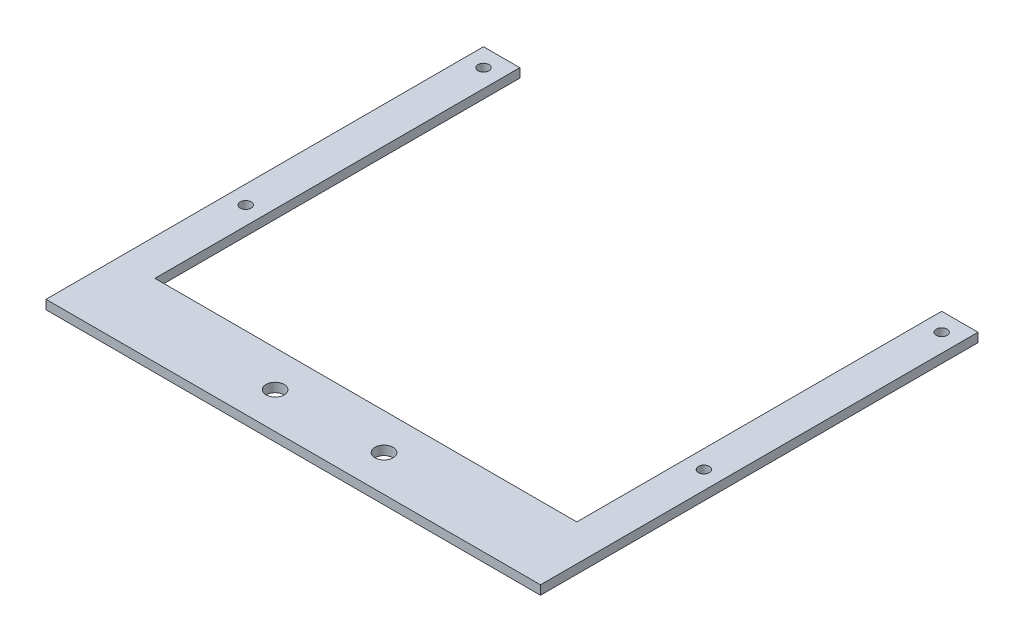
ISO-10303-21;
HEADER;
FILE_DESCRIPTION(('STEP AP214'),'2;1');
FILE_NAME('part.step','',(''),(''),'','','');
FILE_SCHEMA(('AUTOMOTIVE_DESIGN { 1 0 10303 214 1 1 1 1 }'));
ENDSEC;
DATA;
#1=APPLICATION_CONTEXT('core data for automotive mechanical design processes');
#2=APPLICATION_PROTOCOL_DEFINITION('international standard','automotive_design',2000,#1);
#3=PRODUCT_CONTEXT('',#1,'mechanical');
#4=PRODUCT('Part','Part','',(#3));
#5=PRODUCT_RELATED_PRODUCT_CATEGORY('part','',(#4));
#6=PRODUCT_DEFINITION_FORMATION('','',#4);
#7=PRODUCT_DEFINITION_CONTEXT('part definition',#1,'design');
#8=PRODUCT_DEFINITION('design','',#6,#7);
#9=PRODUCT_DEFINITION_SHAPE('','',#8);
#10=(LENGTH_UNIT() NAMED_UNIT(*) SI_UNIT(.MILLI.,.METRE.));
#11=(NAMED_UNIT(*) PLANE_ANGLE_UNIT() SI_UNIT($,.RADIAN.));
#12=(NAMED_UNIT(*) SI_UNIT($,.STERADIAN.) SOLID_ANGLE_UNIT());
#13=UNCERTAINTY_MEASURE_WITH_UNIT(LENGTH_MEASURE(1.E-05),#10,'distance_accuracy_value','');
#14=(GEOMETRIC_REPRESENTATION_CONTEXT(3) GLOBAL_UNCERTAINTY_ASSIGNED_CONTEXT((#13)) GLOBAL_UNIT_ASSIGNED_CONTEXT((#10,
#11,#12)) REPRESENTATION_CONTEXT('',''));
#15=CARTESIAN_POINT('',(0.,0.,0.));
#16=DIRECTION('',(0.,0.,1.));
#17=DIRECTION('',(1.,0.,0.));
#18=AXIS2_PLACEMENT_3D('',#15,#16,#17);
#19=CARTESIAN_POINT('',(0.,2.5,0.));
#20=DIRECTION('',(0.,1.,0.));
#21=DIRECTION('',(0.,0.,1.));
#22=AXIS2_PLACEMENT_3D('',#19,#20,#21);
#23=PLANE('',#22);
#24=CARTESIAN_POINT('',(-15.,2.5,40.));
#25=DIRECTION('',(0.,1.,0.));
#26=DIRECTION('',(0.,0.,1.));
#27=AXIS2_PLACEMENT_3D('',#24,#25,#26);
#28=CIRCLE('',#27,2.5);
#29=CARTESIAN_POINT('',(-15.,2.5,42.5));
#30=VERTEX_POINT('',#29);
#31=EDGE_CURVE('E204',#30,#30,#28,.T.);
#32=ORIENTED_EDGE('',*,*,#31,.F.);
#33=EDGE_LOOP('',(#32));
#34=FACE_BOUND('',#33,.T.);
#35=CARTESIAN_POINT('',(63.1,2.5,0.));
#36=DIRECTION('',(0.,1.,0.));
#37=DIRECTION('',(0.,0.,-1.));
#38=AXIS2_PLACEMENT_3D('',#35,#36,#37);
#39=CIRCLE('',#38,1.5);
#40=CARTESIAN_POINT('',(63.1,2.5,-1.5));
#41=VERTEX_POINT('',#40);
#42=EDGE_CURVE('E192',#41,#41,#39,.T.);
#43=ORIENTED_EDGE('',*,*,#42,.F.);
#44=EDGE_LOOP('',(#43));
#45=FACE_BOUND('',#44,.T.);
#46=CARTESIAN_POINT('',(-63.1,2.5,-65.5));
#47=DIRECTION('',(0.,1.,0.));
#48=DIRECTION('',(0.,0.,1.));
#49=AXIS2_PLACEMENT_3D('',#46,#47,#48);
#50=CIRCLE('',#49,1.5);
#51=CARTESIAN_POINT('',(-63.1,2.5,-64.));
#52=VERTEX_POINT('',#51);
#53=EDGE_CURVE('E138',#52,#52,#50,.T.);
#54=ORIENTED_EDGE('',*,*,#53,.F.);
#55=EDGE_LOOP('',(#54));
#56=FACE_BOUND('',#55,.T.);
#57=DIRECTION('',(0.,0.,-1.));
#58=VECTOR('',#57,1.);
#59=CARTESIAN_POINT('',(-58.1,2.5,-70.5));
#60=LINE('',#59,#58);
#61=CARTESIAN_POINT('',(-58.1,2.5,30.));
#62=VERTEX_POINT('',#61);
#63=CARTESIAN_POINT('',(-58.1,2.5,-70.5));
#64=VERTEX_POINT('',#63);
#65=EDGE_CURVE('E149',#62,#64,#60,.T.);
#66=ORIENTED_EDGE('',*,*,#65,.T.);
#67=DIRECTION('',(-1.,0.,0.));
#68=VECTOR('',#67,1.);
#69=CARTESIAN_POINT('',(-68.1,2.5,-70.5));
#70=LINE('',#69,#68);
#71=CARTESIAN_POINT('',(-68.1,2.5,-70.5));
#72=VERTEX_POINT('',#71);
#73=EDGE_CURVE('E97',#64,#72,#70,.T.);
#74=ORIENTED_EDGE('',*,*,#73,.T.);
#75=DIRECTION('',(0.,0.,1.));
#76=VECTOR('',#75,1.);
#77=CARTESIAN_POINT('',(-68.1,2.5,-70.5));
#78=LINE('',#77,#76);
#79=CARTESIAN_POINT('',(-68.1,2.5,50.));
#80=VERTEX_POINT('',#79);
#81=EDGE_CURVE('E164',#72,#80,#78,.T.);
#82=ORIENTED_EDGE('',*,*,#81,.T.);
#83=DIRECTION('',(1.,0.,0.));
#84=VECTOR('',#83,1.);
#85=CARTESIAN_POINT('',(-68.1,2.5,50.));
#86=LINE('',#85,#84);
#87=CARTESIAN_POINT('',(68.1,2.5,50.));
#88=VERTEX_POINT('',#87);
#89=EDGE_CURVE('E177',#80,#88,#86,.T.);
#90=ORIENTED_EDGE('',*,*,#89,.T.);
#91=DIRECTION('',(0.,0.,-1.));
#92=VECTOR('',#91,1.);
#93=CARTESIAN_POINT('',(68.1,2.5,-70.5));
#94=LINE('',#93,#92);
#95=CARTESIAN_POINT('',(68.1,2.5,-70.5));
#96=VERTEX_POINT('',#95);
#97=EDGE_CURVE('E116',#88,#96,#94,.T.);
#98=ORIENTED_EDGE('',*,*,#97,.T.);
#99=DIRECTION('',(-1.,0.,0.));
#100=VECTOR('',#99,1.);
#101=CARTESIAN_POINT('',(68.1,2.5,-70.5));
#102=LINE('',#101,#100);
#103=CARTESIAN_POINT('',(58.1,2.5,-70.5));
#104=VERTEX_POINT('',#103);
#105=EDGE_CURVE('E110',#96,#104,#102,.T.);
#106=ORIENTED_EDGE('',*,*,#105,.T.);
#107=DIRECTION('',(0.,0.,1.));
#108=VECTOR('',#107,1.);
#109=CARTESIAN_POINT('',(58.1,2.5,-70.5));
#110=LINE('',#109,#108);
#111=CARTESIAN_POINT('',(58.1,2.5,30.));
#112=VERTEX_POINT('',#111);
#113=EDGE_CURVE('E114',#104,#112,#110,.T.);
#114=ORIENTED_EDGE('',*,*,#113,.T.);
#115=DIRECTION('',(-1.,0.,0.));
#116=VECTOR('',#115,1.);
#117=CARTESIAN_POINT('',(-58.1,2.5,30.));
#118=LINE('',#117,#116);
#119=EDGE_CURVE('E54',#112,#62,#118,.T.);
#120=ORIENTED_EDGE('',*,*,#119,.T.);
#121=EDGE_LOOP('',(#66,#74,#82,#90,#98,#106,#114,#120));
#122=FACE_BOUND('',#121,.T.);
#123=CARTESIAN_POINT('',(-63.1,2.5,0.));
#124=DIRECTION('',(0.,1.,0.));
#125=DIRECTION('',(0.,0.,1.));
#126=AXIS2_PLACEMENT_3D('',#123,#124,#125);
#127=CIRCLE('',#126,1.5);
#128=CARTESIAN_POINT('',(-63.1,2.5,1.5));
#129=VERTEX_POINT('',#128);
#130=EDGE_CURVE('E186',#129,#129,#127,.T.);
#131=ORIENTED_EDGE('',*,*,#130,.F.);
#132=EDGE_LOOP('',(#131));
#133=FACE_BOUND('',#132,.T.);
#134=CARTESIAN_POINT('',(63.1,2.5,-65.5));
#135=DIRECTION('',(0.,1.,0.));
#136=DIRECTION('',(0.,0.,-1.));
#137=AXIS2_PLACEMENT_3D('',#134,#135,#136);
#138=CIRCLE('',#137,1.5);
#139=CARTESIAN_POINT('',(63.1,2.5,-67.));
#140=VERTEX_POINT('',#139);
#141=EDGE_CURVE('E198',#140,#140,#138,.T.);
#142=ORIENTED_EDGE('',*,*,#141,.F.);
#143=EDGE_LOOP('',(#142));
#144=FACE_BOUND('',#143,.T.);
#145=CARTESIAN_POINT('',(15.,2.5,40.));
#146=DIRECTION('',(0.,1.,0.));
#147=DIRECTION('',(0.,0.,-1.));
#148=AXIS2_PLACEMENT_3D('',#145,#146,#147);
#149=CIRCLE('',#148,2.5);
#150=CARTESIAN_POINT('',(15.,2.5,37.5));
#151=VERTEX_POINT('',#150);
#152=EDGE_CURVE('E210',#151,#151,#149,.T.);
#153=ORIENTED_EDGE('',*,*,#152,.F.);
#154=EDGE_LOOP('',(#153));
#155=FACE_BOUND('',#154,.T.);
#156=ADVANCED_FACE('F37',(#34,#45,#56,#122,#133,#144,#155),#23,.T.);
#157=CARTESIAN_POINT('',(0.,0.,0.));
#158=DIRECTION('',(0.,1.,0.));
#159=DIRECTION('',(0.,0.,1.));
#160=AXIS2_PLACEMENT_3D('',#157,#158,#159);
#161=PLANE('',#160);
#162=DIRECTION('',(0.,0.,-1.));
#163=VECTOR('',#162,1.);
#164=CARTESIAN_POINT('',(-58.1,0.,-70.5));
#165=LINE('',#164,#163);
#166=CARTESIAN_POINT('',(-58.1,0.,30.));
#167=VERTEX_POINT('',#166);
#168=CARTESIAN_POINT('',(-58.1,0.,-70.5));
#169=VERTEX_POINT('',#168);
#170=EDGE_CURVE('E134',#167,#169,#165,.T.);
#171=ORIENTED_EDGE('',*,*,#170,.F.);
#172=DIRECTION('',(-1.,0.,0.));
#173=VECTOR('',#172,1.);
#174=CARTESIAN_POINT('',(-58.1,0.,30.));
#175=LINE('',#174,#173);
#176=CARTESIAN_POINT('',(58.1,0.,30.));
#177=VERTEX_POINT('',#176);
#178=EDGE_CURVE('E89',#177,#167,#175,.T.);
#179=ORIENTED_EDGE('',*,*,#178,.F.);
#180=DIRECTION('',(0.,0.,1.));
#181=VECTOR('',#180,1.);
#182=CARTESIAN_POINT('',(58.1,0.,-70.5));
#183=LINE('',#182,#181);
#184=CARTESIAN_POINT('',(58.1,0.,-70.5));
#185=VERTEX_POINT('',#184);
#186=EDGE_CURVE('E83',#185,#177,#183,.T.);
#187=ORIENTED_EDGE('',*,*,#186,.F.);
#188=DIRECTION('',(-1.,0.,0.));
#189=VECTOR('',#188,1.);
#190=CARTESIAN_POINT('',(68.1,0.,-70.5));
#191=LINE('',#190,#189);
#192=CARTESIAN_POINT('',(68.1,0.,-70.5));
#193=VERTEX_POINT('',#192);
#194=EDGE_CURVE('E124',#193,#185,#191,.T.);
#195=ORIENTED_EDGE('',*,*,#194,.F.);
#196=DIRECTION('',(0.,0.,-1.));
#197=VECTOR('',#196,1.);
#198=CARTESIAN_POINT('',(68.1,0.,-70.5));
#199=LINE('',#198,#197);
#200=CARTESIAN_POINT('',(68.1,0.,50.));
#201=VERTEX_POINT('',#200);
#202=EDGE_CURVE('E144',#201,#193,#199,.T.);
#203=ORIENTED_EDGE('',*,*,#202,.F.);
#204=DIRECTION('',(1.,0.,0.));
#205=VECTOR('',#204,1.);
#206=CARTESIAN_POINT('',(-68.1,0.,50.));
#207=LINE('',#206,#205);
#208=CARTESIAN_POINT('',(-68.1,0.,50.));
#209=VERTEX_POINT('',#208);
#210=EDGE_CURVE('E142',#209,#201,#207,.T.);
#211=ORIENTED_EDGE('',*,*,#210,.F.);
#212=DIRECTION('',(0.,0.,1.));
#213=VECTOR('',#212,1.);
#214=CARTESIAN_POINT('',(-68.1,0.,-70.5));
#215=LINE('',#214,#213);
#216=CARTESIAN_POINT('',(-68.1,0.,-70.5));
#217=VERTEX_POINT('',#216);
#218=EDGE_CURVE('E140',#217,#209,#215,.T.);
#219=ORIENTED_EDGE('',*,*,#218,.F.);
#220=DIRECTION('',(-1.,0.,0.));
#221=VECTOR('',#220,1.);
#222=CARTESIAN_POINT('',(-68.1,0.,-70.5));
#223=LINE('',#222,#221);
#224=EDGE_CURVE('E137',#169,#217,#223,.T.);
#225=ORIENTED_EDGE('',*,*,#224,.F.);
#226=EDGE_LOOP('',(#171,#179,#187,#195,#203,#211,#219,#225));
#227=FACE_BOUND('',#226,.T.);
#228=CARTESIAN_POINT('',(-63.1,0.,-65.5));
#229=DIRECTION('',(0.,1.,0.));
#230=DIRECTION('',(0.,0.,1.));
#231=AXIS2_PLACEMENT_3D('',#228,#229,#230);
#232=CIRCLE('',#231,1.5);
#233=CARTESIAN_POINT('',(-63.1,0.,-64.));
#234=VERTEX_POINT('',#233);
#235=EDGE_CURVE('E183',#234,#234,#232,.T.);
#236=ORIENTED_EDGE('',*,*,#235,.T.);
#237=EDGE_LOOP('',(#236));
#238=FACE_BOUND('',#237,.T.);
#239=CARTESIAN_POINT('',(-63.1,0.,0.));
#240=DIRECTION('',(0.,1.,0.));
#241=DIRECTION('',(0.,0.,1.));
#242=AXIS2_PLACEMENT_3D('',#239,#240,#241);
#243=CIRCLE('',#242,1.5);
#244=CARTESIAN_POINT('',(-63.1,0.,1.5));
#245=VERTEX_POINT('',#244);
#246=EDGE_CURVE('E189',#245,#245,#243,.T.);
#247=ORIENTED_EDGE('',*,*,#246,.T.);
#248=EDGE_LOOP('',(#247));
#249=FACE_BOUND('',#248,.T.);
#250=CARTESIAN_POINT('',(63.1,0.,0.));
#251=DIRECTION('',(0.,1.,0.));
#252=DIRECTION('',(0.,0.,-1.));
#253=AXIS2_PLACEMENT_3D('',#250,#251,#252);
#254=CIRCLE('',#253,1.5);
#255=CARTESIAN_POINT('',(63.1,0.,-1.5));
#256=VERTEX_POINT('',#255);
#257=EDGE_CURVE('E195',#256,#256,#254,.T.);
#258=ORIENTED_EDGE('',*,*,#257,.T.);
#259=EDGE_LOOP('',(#258));
#260=FACE_BOUND('',#259,.T.);
#261=CARTESIAN_POINT('',(63.1,0.,-65.5));
#262=DIRECTION('',(0.,1.,0.));
#263=DIRECTION('',(0.,0.,-1.));
#264=AXIS2_PLACEMENT_3D('',#261,#262,#263);
#265=CIRCLE('',#264,1.5);
#266=CARTESIAN_POINT('',(63.1,0.,-67.));
#267=VERTEX_POINT('',#266);
#268=EDGE_CURVE('E201',#267,#267,#265,.T.);
#269=ORIENTED_EDGE('',*,*,#268,.T.);
#270=EDGE_LOOP('',(#269));
#271=FACE_BOUND('',#270,.T.);
#272=CARTESIAN_POINT('',(-15.,0.,40.));
#273=DIRECTION('',(0.,1.,0.));
#274=DIRECTION('',(0.,0.,1.));
#275=AXIS2_PLACEMENT_3D('',#272,#273,#274);
#276=CIRCLE('',#275,2.5);
#277=CARTESIAN_POINT('',(-15.,0.,42.5));
#278=VERTEX_POINT('',#277);
#279=EDGE_CURVE('E207',#278,#278,#276,.T.);
#280=ORIENTED_EDGE('',*,*,#279,.T.);
#281=EDGE_LOOP('',(#280));
#282=FACE_BOUND('',#281,.T.);
#283=CARTESIAN_POINT('',(15.,0.,40.));
#284=DIRECTION('',(0.,1.,0.));
#285=DIRECTION('',(0.,0.,-1.));
#286=AXIS2_PLACEMENT_3D('',#283,#284,#285);
#287=CIRCLE('',#286,2.5);
#288=CARTESIAN_POINT('',(15.,0.,37.5));
#289=VERTEX_POINT('',#288);
#290=EDGE_CURVE('E213',#289,#289,#287,.T.);
#291=ORIENTED_EDGE('',*,*,#290,.T.);
#292=EDGE_LOOP('',(#291));
#293=FACE_BOUND('',#292,.T.);
#294=ADVANCED_FACE('F168',(#227,#238,#249,#260,#271,#282,#293),#161,.F.);
#295=CARTESIAN_POINT('',(-58.1,2.5,-70.5));
#296=DIRECTION('',(-1.,0.,0.));
#297=DIRECTION('',(0.,0.,1.));
#298=AXIS2_PLACEMENT_3D('',#295,#296,#297);
#299=PLANE('',#298);
#300=ORIENTED_EDGE('',*,*,#170,.T.);
#301=DIRECTION('',(0.,-1.,0.));
#302=VECTOR('',#301,1.);
#303=CARTESIAN_POINT('',(-58.1,2.5,-70.5));
#304=LINE('',#303,#302);
#305=EDGE_CURVE('E11',#64,#169,#304,.T.);
#306=ORIENTED_EDGE('',*,*,#305,.F.);
#307=ORIENTED_EDGE('',*,*,#65,.F.);
#308=DIRECTION('',(0.,-1.,0.));
#309=VECTOR('',#308,1.);
#310=CARTESIAN_POINT('',(-58.1,2.5,30.));
#311=LINE('',#310,#309);
#312=EDGE_CURVE('E130',#62,#167,#311,.T.);
#313=ORIENTED_EDGE('',*,*,#312,.T.);
#314=EDGE_LOOP('',(#300,#306,#307,#313));
#315=FACE_BOUND('',#314,.T.);
#316=ADVANCED_FACE('F39',(#315),#299,.F.);
#317=CARTESIAN_POINT('',(-68.1,2.5,-70.5));
#318=DIRECTION('',(0.,0.,1.));
#319=DIRECTION('',(1.,0.,0.));
#320=AXIS2_PLACEMENT_3D('',#317,#318,#319);
#321=PLANE('',#320);
#322=ORIENTED_EDGE('',*,*,#224,.T.);
#323=DIRECTION('',(0.,-1.,0.));
#324=VECTOR('',#323,1.);
#325=CARTESIAN_POINT('',(-68.1,2.5,-70.5));
#326=LINE('',#325,#324);
#327=EDGE_CURVE('E46',#72,#217,#326,.T.);
#328=ORIENTED_EDGE('',*,*,#327,.F.);
#329=ORIENTED_EDGE('',*,*,#73,.F.);
#330=ORIENTED_EDGE('',*,*,#305,.T.);
#331=EDGE_LOOP('',(#322,#328,#329,#330));
#332=FACE_BOUND('',#331,.T.);
#333=ADVANCED_FACE('F247',(#332),#321,.F.);
#334=CARTESIAN_POINT('',(-68.1,2.5,-70.5));
#335=DIRECTION('',(1.,0.,0.));
#336=DIRECTION('',(0.,0.,-1.));
#337=AXIS2_PLACEMENT_3D('',#334,#335,#336);
#338=PLANE('',#337);
#339=ORIENTED_EDGE('',*,*,#218,.T.);
#340=DIRECTION('',(0.,-1.,0.));
#341=VECTOR('',#340,1.);
#342=CARTESIAN_POINT('',(-68.1,2.5,50.));
#343=LINE('',#342,#341);
#344=EDGE_CURVE('E156',#80,#209,#343,.T.);
#345=ORIENTED_EDGE('',*,*,#344,.F.);
#346=ORIENTED_EDGE('',*,*,#81,.F.);
#347=ORIENTED_EDGE('',*,*,#327,.T.);
#348=EDGE_LOOP('',(#339,#345,#346,#347));
#349=FACE_BOUND('',#348,.T.);
#350=ADVANCED_FACE('F162',(#349),#338,.F.);
#351=CARTESIAN_POINT('',(-68.1,2.5,50.));
#352=DIRECTION('',(0.,0.,-1.));
#353=DIRECTION('',(-1.,0.,0.));
#354=AXIS2_PLACEMENT_3D('',#351,#352,#353);
#355=PLANE('',#354);
#356=ORIENTED_EDGE('',*,*,#210,.T.);
#357=DIRECTION('',(0.,-1.,0.));
#358=VECTOR('',#357,1.);
#359=CARTESIAN_POINT('',(68.1,2.5,50.));
#360=LINE('',#359,#358);
#361=EDGE_CURVE('E153',#88,#201,#360,.T.);
#362=ORIENTED_EDGE('',*,*,#361,.F.);
#363=ORIENTED_EDGE('',*,*,#89,.F.);
#364=ORIENTED_EDGE('',*,*,#344,.T.);
#365=EDGE_LOOP('',(#356,#362,#363,#364));
#366=FACE_BOUND('',#365,.T.);
#367=ADVANCED_FACE('F173',(#366),#355,.F.);
#368=CARTESIAN_POINT('',(68.1,2.5,-70.5));
#369=DIRECTION('',(-1.,0.,0.));
#370=DIRECTION('',(0.,0.,1.));
#371=AXIS2_PLACEMENT_3D('',#368,#369,#370);
#372=PLANE('',#371);
#373=ORIENTED_EDGE('',*,*,#202,.T.);
#374=DIRECTION('',(0.,-1.,0.));
#375=VECTOR('',#374,1.);
#376=CARTESIAN_POINT('',(68.1,2.5,-70.5));
#377=LINE('',#376,#375);
#378=EDGE_CURVE('E125',#96,#193,#377,.T.);
#379=ORIENTED_EDGE('',*,*,#378,.F.);
#380=ORIENTED_EDGE('',*,*,#97,.F.);
#381=ORIENTED_EDGE('',*,*,#361,.T.);
#382=EDGE_LOOP('',(#373,#379,#380,#381));
#383=FACE_BOUND('',#382,.T.);
#384=ADVANCED_FACE('F176',(#383),#372,.F.);
#385=CARTESIAN_POINT('',(68.1,2.5,-70.5));
#386=DIRECTION('',(0.,0.,1.));
#387=DIRECTION('',(1.,0.,0.));
#388=AXIS2_PLACEMENT_3D('',#385,#386,#387);
#389=PLANE('',#388);
#390=ORIENTED_EDGE('',*,*,#194,.T.);
#391=DIRECTION('',(0.,-1.,0.));
#392=VECTOR('',#391,1.);
#393=CARTESIAN_POINT('',(58.1,2.5,-70.5));
#394=LINE('',#393,#392);
#395=EDGE_CURVE('E121',#104,#185,#394,.T.);
#396=ORIENTED_EDGE('',*,*,#395,.F.);
#397=ORIENTED_EDGE('',*,*,#105,.F.);
#398=ORIENTED_EDGE('',*,*,#378,.T.);
#399=EDGE_LOOP('',(#390,#396,#397,#398));
#400=FACE_BOUND('',#399,.T.);
#401=ADVANCED_FACE('F122',(#400),#389,.F.);
#402=CARTESIAN_POINT('',(58.1,2.5,-70.5));
#403=DIRECTION('',(1.,0.,0.));
#404=DIRECTION('',(0.,0.,-1.));
#405=AXIS2_PLACEMENT_3D('',#402,#403,#404);
#406=PLANE('',#405);
#407=ORIENTED_EDGE('',*,*,#186,.T.);
#408=DIRECTION('',(0.,-1.,0.));
#409=VECTOR('',#408,1.);
#410=CARTESIAN_POINT('',(58.1,2.5,30.));
#411=LINE('',#410,#409);
#412=EDGE_CURVE('E126',#112,#177,#411,.T.);
#413=ORIENTED_EDGE('',*,*,#412,.F.);
#414=ORIENTED_EDGE('',*,*,#113,.F.);
#415=ORIENTED_EDGE('',*,*,#395,.T.);
#416=EDGE_LOOP('',(#407,#413,#414,#415));
#417=FACE_BOUND('',#416,.T.);
#418=ADVANCED_FACE('F128',(#417),#406,.F.);
#419=CARTESIAN_POINT('',(-58.1,2.5,30.));
#420=DIRECTION('',(0.,0.,1.));
#421=DIRECTION('',(1.,0.,0.));
#422=AXIS2_PLACEMENT_3D('',#419,#420,#421);
#423=PLANE('',#422);
#424=ORIENTED_EDGE('',*,*,#178,.T.);
#425=ORIENTED_EDGE('',*,*,#312,.F.);
#426=ORIENTED_EDGE('',*,*,#119,.F.);
#427=ORIENTED_EDGE('',*,*,#412,.T.);
#428=EDGE_LOOP('',(#424,#425,#426,#427));
#429=FACE_BOUND('',#428,.T.);
#430=ADVANCED_FACE('F235',(#429),#423,.F.);
#431=CARTESIAN_POINT('',(-63.1,2.5,-65.5));
#432=DIRECTION('',(0.,-1.,0.));
#433=DIRECTION('',(0.,0.,-1.));
#434=AXIS2_PLACEMENT_3D('',#431,#432,#433);
#435=CYLINDRICAL_SURFACE('',#434,1.5);
#436=ORIENTED_EDGE('',*,*,#53,.T.);
#437=EDGE_LOOP('',(#436));
#438=FACE_BOUND('',#437,.T.);
#439=ORIENTED_EDGE('',*,*,#235,.F.);
#440=EDGE_LOOP('',(#439));
#441=FACE_BOUND('',#440,.T.);
#442=ADVANCED_FACE('F232',(#438,#441),#435,.F.);
#443=CARTESIAN_POINT('',(-63.1,2.5,0.));
#444=DIRECTION('',(0.,-1.,0.));
#445=DIRECTION('',(0.,0.,-1.));
#446=AXIS2_PLACEMENT_3D('',#443,#444,#445);
#447=CYLINDRICAL_SURFACE('',#446,1.5);
#448=ORIENTED_EDGE('',*,*,#130,.T.);
#449=EDGE_LOOP('',(#448));
#450=FACE_BOUND('',#449,.T.);
#451=ORIENTED_EDGE('',*,*,#246,.F.);
#452=EDGE_LOOP('',(#451));
#453=FACE_BOUND('',#452,.T.);
#454=ADVANCED_FACE('F311',(#450,#453),#447,.F.);
#455=CARTESIAN_POINT('',(63.1,2.5,0.));
#456=DIRECTION('',(0.,-1.,0.));
#457=DIRECTION('',(0.,0.,-1.));
#458=AXIS2_PLACEMENT_3D('',#455,#456,#457);
#459=CYLINDRICAL_SURFACE('',#458,1.5);
#460=ORIENTED_EDGE('',*,*,#42,.T.);
#461=EDGE_LOOP('',(#460));
#462=FACE_BOUND('',#461,.T.);
#463=ORIENTED_EDGE('',*,*,#257,.F.);
#464=EDGE_LOOP('',(#463));
#465=FACE_BOUND('',#464,.T.);
#466=ADVANCED_FACE('F319',(#462,#465),#459,.F.);
#467=CARTESIAN_POINT('',(63.1,2.5,-65.5));
#468=DIRECTION('',(0.,-1.,0.));
#469=DIRECTION('',(0.,0.,-1.));
#470=AXIS2_PLACEMENT_3D('',#467,#468,#469);
#471=CYLINDRICAL_SURFACE('',#470,1.5);
#472=ORIENTED_EDGE('',*,*,#141,.T.);
#473=EDGE_LOOP('',(#472));
#474=FACE_BOUND('',#473,.T.);
#475=ORIENTED_EDGE('',*,*,#268,.F.);
#476=EDGE_LOOP('',(#475));
#477=FACE_BOUND('',#476,.T.);
#478=ADVANCED_FACE('F327',(#474,#477),#471,.F.);
#479=CARTESIAN_POINT('',(-15.,2.5,40.));
#480=DIRECTION('',(0.,-1.,0.));
#481=DIRECTION('',(0.,0.,-1.));
#482=AXIS2_PLACEMENT_3D('',#479,#480,#481);
#483=CYLINDRICAL_SURFACE('',#482,2.5);
#484=ORIENTED_EDGE('',*,*,#31,.T.);
#485=EDGE_LOOP('',(#484));
#486=FACE_BOUND('',#485,.T.);
#487=ORIENTED_EDGE('',*,*,#279,.F.);
#488=EDGE_LOOP('',(#487));
#489=FACE_BOUND('',#488,.T.);
#490=ADVANCED_FACE('F336',(#486,#489),#483,.F.);
#491=CARTESIAN_POINT('',(15.,2.5,40.));
#492=DIRECTION('',(0.,-1.,0.));
#493=DIRECTION('',(0.,0.,-1.));
#494=AXIS2_PLACEMENT_3D('',#491,#492,#493);
#495=CYLINDRICAL_SURFACE('',#494,2.5);
#496=ORIENTED_EDGE('',*,*,#152,.T.);
#497=EDGE_LOOP('',(#496));
#498=FACE_BOUND('',#497,.T.);
#499=ORIENTED_EDGE('',*,*,#290,.F.);
#500=EDGE_LOOP('',(#499));
#501=FACE_BOUND('',#500,.T.);
#502=ADVANCED_FACE('F219',(#498,#501),#495,.F.);
#503=CLOSED_SHELL('',(#156,#294,#316,#333,#350,#367,#384,#401,#418,#430,#442,#454,#466,#478,
#490,#502));
#504=MANIFOLD_SOLID_BREP('B2',#503);
#505=ADVANCED_BREP_SHAPE_REPRESENTATION('',(#18,#504),#14);
#506=SHAPE_DEFINITION_REPRESENTATION(#9,#505);
ENDSEC;
END-ISO-10303-21;
